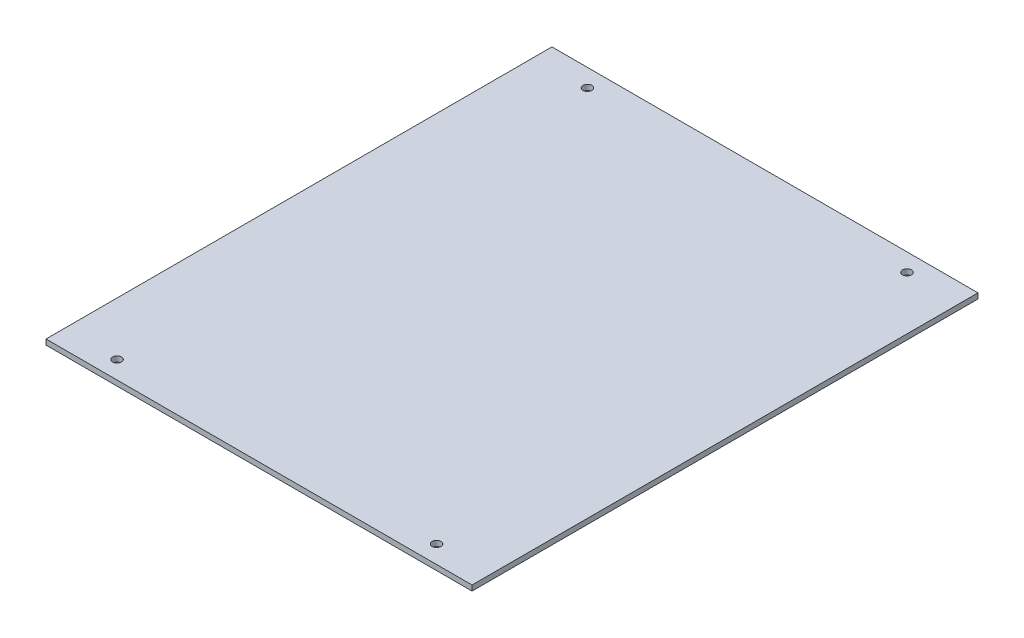
ISO-10303-21;
HEADER;
FILE_DESCRIPTION(('STEP AP214'),'2;1');
FILE_NAME('part.step','',(''),(''),'','','');
FILE_SCHEMA(('AUTOMOTIVE_DESIGN { 1 0 10303 214 1 1 1 1 }'));
ENDSEC;
DATA;
#1=APPLICATION_CONTEXT('core data for automotive mechanical design processes');
#2=APPLICATION_PROTOCOL_DEFINITION('international standard','automotive_design',2000,#1);
#3=PRODUCT_CONTEXT('',#1,'mechanical');
#4=PRODUCT('Part','Part','',(#3));
#5=PRODUCT_RELATED_PRODUCT_CATEGORY('part','',(#4));
#6=PRODUCT_DEFINITION_FORMATION('','',#4);
#7=PRODUCT_DEFINITION_CONTEXT('part definition',#1,'design');
#8=PRODUCT_DEFINITION('design','',#6,#7);
#9=PRODUCT_DEFINITION_SHAPE('','',#8);
#10=(LENGTH_UNIT() NAMED_UNIT(*) SI_UNIT(.MILLI.,.METRE.));
#11=(NAMED_UNIT(*) PLANE_ANGLE_UNIT() SI_UNIT($,.RADIAN.));
#12=(NAMED_UNIT(*) SI_UNIT($,.STERADIAN.) SOLID_ANGLE_UNIT());
#13=UNCERTAINTY_MEASURE_WITH_UNIT(LENGTH_MEASURE(1.E-05),#10,'distance_accuracy_value','');
#14=(GEOMETRIC_REPRESENTATION_CONTEXT(3) GLOBAL_UNCERTAINTY_ASSIGNED_CONTEXT((#13)) GLOBAL_UNIT_ASSIGNED_CONTEXT((#10,
#11,#12)) REPRESENTATION_CONTEXT('',''));
#15=CARTESIAN_POINT('',(0.,0.,0.));
#16=DIRECTION('',(0.,0.,1.));
#17=DIRECTION('',(1.,0.,0.));
#18=AXIS2_PLACEMENT_3D('',#15,#16,#17);
#19=CARTESIAN_POINT('',(120.,3.,-142.5));
#20=DIRECTION('',(-1.,0.,0.));
#21=DIRECTION('',(0.,0.,1.));
#22=AXIS2_PLACEMENT_3D('',#19,#20,#21);
#23=PLANE('',#22);
#24=DIRECTION('',(0.,0.,-1.));
#25=VECTOR('',#24,1.);
#26=CARTESIAN_POINT('',(120.,0.,-142.5));
#27=LINE('',#26,#25);
#28=CARTESIAN_POINT('',(120.,0.,142.5));
#29=VERTEX_POINT('',#28);
#30=CARTESIAN_POINT('',(120.,0.,-142.5));
#31=VERTEX_POINT('',#30);
#32=EDGE_CURVE('E96',#29,#31,#27,.T.);
#33=ORIENTED_EDGE('',*,*,#32,.T.);
#34=DIRECTION('',(0.,-1.,0.));
#35=VECTOR('',#34,1.);
#36=CARTESIAN_POINT('',(120.,3.,-142.5));
#37=LINE('',#36,#35);
#38=CARTESIAN_POINT('',(120.,3.,-142.5));
#39=VERTEX_POINT('',#38);
#40=EDGE_CURVE('E11',#39,#31,#37,.T.);
#41=ORIENTED_EDGE('',*,*,#40,.F.);
#42=DIRECTION('',(0.,0.,-1.));
#43=VECTOR('',#42,1.);
#44=CARTESIAN_POINT('',(120.,3.,-142.5));
#45=LINE('',#44,#43);
#46=CARTESIAN_POINT('',(120.,3.,142.5));
#47=VERTEX_POINT('',#46);
#48=EDGE_CURVE('E84',#47,#39,#45,.T.);
#49=ORIENTED_EDGE('',*,*,#48,.F.);
#50=DIRECTION('',(0.,-1.,0.));
#51=VECTOR('',#50,1.);
#52=CARTESIAN_POINT('',(120.,3.,142.5));
#53=LINE('',#52,#51);
#54=EDGE_CURVE('E92',#47,#29,#53,.T.);
#55=ORIENTED_EDGE('',*,*,#54,.T.);
#56=EDGE_LOOP('',(#33,#41,#49,#55));
#57=FACE_BOUND('',#56,.T.);
#58=ADVANCED_FACE('F33',(#57),#23,.F.);
#59=CARTESIAN_POINT('',(-120.,3.,-142.5));
#60=DIRECTION('',(0.,0.,1.));
#61=DIRECTION('',(1.,0.,0.));
#62=AXIS2_PLACEMENT_3D('',#59,#60,#61);
#63=PLANE('',#62);
#64=DIRECTION('',(-1.,0.,0.));
#65=VECTOR('',#64,1.);
#66=CARTESIAN_POINT('',(-120.,0.,-142.5));
#67=LINE('',#66,#65);
#68=CARTESIAN_POINT('',(-120.,0.,-142.5));
#69=VERTEX_POINT('',#68);
#70=EDGE_CURVE('E88',#31,#69,#67,.T.);
#71=ORIENTED_EDGE('',*,*,#70,.T.);
#72=DIRECTION('',(0.,-1.,0.));
#73=VECTOR('',#72,1.);
#74=CARTESIAN_POINT('',(-120.,3.,-142.5));
#75=LINE('',#74,#73);
#76=CARTESIAN_POINT('',(-120.,3.,-142.5));
#77=VERTEX_POINT('',#76);
#78=EDGE_CURVE('E41',#77,#69,#75,.T.);
#79=ORIENTED_EDGE('',*,*,#78,.F.);
#80=DIRECTION('',(-1.,0.,0.));
#81=VECTOR('',#80,1.);
#82=CARTESIAN_POINT('',(-120.,3.,-142.5));
#83=LINE('',#82,#81);
#84=EDGE_CURVE('E79',#39,#77,#83,.T.);
#85=ORIENTED_EDGE('',*,*,#84,.F.);
#86=ORIENTED_EDGE('',*,*,#40,.T.);
#87=EDGE_LOOP('',(#71,#79,#85,#86));
#88=FACE_BOUND('',#87,.T.);
#89=ADVANCED_FACE('F87',(#88),#63,.F.);
#90=CARTESIAN_POINT('',(-120.,3.,-142.5));
#91=DIRECTION('',(1.,0.,0.));
#92=DIRECTION('',(0.,0.,-1.));
#93=AXIS2_PLACEMENT_3D('',#90,#91,#92);
#94=PLANE('',#93);
#95=DIRECTION('',(0.,0.,1.));
#96=VECTOR('',#95,1.);
#97=CARTESIAN_POINT('',(-120.,0.,-142.5));
#98=LINE('',#97,#96);
#99=CARTESIAN_POINT('',(-120.,0.,142.5));
#100=VERTEX_POINT('',#99);
#101=EDGE_CURVE('E66',#69,#100,#98,.T.);
#102=ORIENTED_EDGE('',*,*,#101,.T.);
#103=DIRECTION('',(0.,-1.,0.));
#104=VECTOR('',#103,1.);
#105=CARTESIAN_POINT('',(-120.,3.,142.5));
#106=LINE('',#105,#104);
#107=CARTESIAN_POINT('',(-120.,3.,142.5));
#108=VERTEX_POINT('',#107);
#109=EDGE_CURVE('E89',#108,#100,#106,.T.);
#110=ORIENTED_EDGE('',*,*,#109,.F.);
#111=DIRECTION('',(0.,0.,1.));
#112=VECTOR('',#111,1.);
#113=CARTESIAN_POINT('',(-120.,3.,-142.5));
#114=LINE('',#113,#112);
#115=EDGE_CURVE('E82',#77,#108,#114,.T.);
#116=ORIENTED_EDGE('',*,*,#115,.F.);
#117=ORIENTED_EDGE('',*,*,#78,.T.);
#118=EDGE_LOOP('',(#102,#110,#116,#117));
#119=FACE_BOUND('',#118,.T.);
#120=ADVANCED_FACE('F90',(#119),#94,.F.);
#121=CARTESIAN_POINT('',(-120.,3.,142.5));
#122=DIRECTION('',(0.,0.,-1.));
#123=DIRECTION('',(-1.,0.,0.));
#124=AXIS2_PLACEMENT_3D('',#121,#122,#123);
#125=PLANE('',#124);
#126=DIRECTION('',(1.,0.,0.));
#127=VECTOR('',#126,1.);
#128=CARTESIAN_POINT('',(-120.,0.,142.5));
#129=LINE('',#128,#127);
#130=EDGE_CURVE('E72',#100,#29,#129,.T.);
#131=ORIENTED_EDGE('',*,*,#130,.T.);
#132=ORIENTED_EDGE('',*,*,#54,.F.);
#133=DIRECTION('',(1.,0.,0.));
#134=VECTOR('',#133,1.);
#135=CARTESIAN_POINT('',(-120.,3.,142.5));
#136=LINE('',#135,#134);
#137=EDGE_CURVE('E49',#108,#47,#136,.T.);
#138=ORIENTED_EDGE('',*,*,#137,.F.);
#139=ORIENTED_EDGE('',*,*,#109,.T.);
#140=EDGE_LOOP('',(#131,#132,#138,#139));
#141=FACE_BOUND('',#140,.T.);
#142=ADVANCED_FACE('F104',(#141),#125,.F.);
#143=CARTESIAN_POINT('',(0.,3.,0.));
#144=DIRECTION('',(0.,1.,0.));
#145=DIRECTION('',(0.,0.,1.));
#146=AXIS2_PLACEMENT_3D('',#143,#144,#145);
#147=PLANE('',#146);
#148=CARTESIAN_POINT('',(-89.9999999999998,3.,-132.5));
#149=DIRECTION('',(0.,1.,0.));
#150=DIRECTION('',(0.,0.,1.));
#151=AXIS2_PLACEMENT_3D('',#148,#149,#150);
#152=CIRCLE('',#151,2.50000000000001);
#153=CARTESIAN_POINT('',(-89.9999999999998,3.,-135.));
#154=VERTEX_POINT('',#153);
#155=EDGE_CURVE('E123',#154,#154,#152,.F.);
#156=ORIENTED_EDGE('',*,*,#155,.T.);
#157=EDGE_LOOP('',(#156));
#158=FACE_BOUND('',#157,.T.);
#159=CARTESIAN_POINT('',(90.,3.,132.5));
#160=DIRECTION('',(0.,1.,0.));
#161=DIRECTION('',(0.,0.,1.));
#162=AXIS2_PLACEMENT_3D('',#159,#160,#161);
#163=CIRCLE('',#162,2.5);
#164=CARTESIAN_POINT('',(90.,3.,130.));
#165=VERTEX_POINT('',#164);
#166=EDGE_CURVE('E116',#165,#165,#163,.F.);
#167=ORIENTED_EDGE('',*,*,#166,.T.);
#168=EDGE_LOOP('',(#167));
#169=FACE_BOUND('',#168,.T.);
#170=CARTESIAN_POINT('',(90.,3.,-132.5));
#171=DIRECTION('',(0.,1.,0.));
#172=DIRECTION('',(0.,0.,1.));
#173=AXIS2_PLACEMENT_3D('',#170,#171,#172);
#174=CIRCLE('',#173,2.5);
#175=CARTESIAN_POINT('',(90.,3.,-135.));
#176=VERTEX_POINT('',#175);
#177=EDGE_CURVE('E128',#176,#176,#174,.F.);
#178=ORIENTED_EDGE('',*,*,#177,.T.);
#179=EDGE_LOOP('',(#178));
#180=FACE_BOUND('',#179,.T.);
#181=CARTESIAN_POINT('',(-89.9999999999998,3.,132.5));
#182=DIRECTION('',(0.,1.,0.));
#183=DIRECTION('',(0.,0.,1.));
#184=AXIS2_PLACEMENT_3D('',#181,#182,#183);
#185=CIRCLE('',#184,2.50000000000001);
#186=CARTESIAN_POINT('',(-89.9999999999998,3.,130.));
#187=VERTEX_POINT('',#186);
#188=EDGE_CURVE('E110',#187,#187,#185,.F.);
#189=ORIENTED_EDGE('',*,*,#188,.T.);
#190=EDGE_LOOP('',(#189));
#191=FACE_BOUND('',#190,.T.);
#192=ORIENTED_EDGE('',*,*,#48,.T.);
#193=ORIENTED_EDGE('',*,*,#84,.T.);
#194=ORIENTED_EDGE('',*,*,#115,.T.);
#195=ORIENTED_EDGE('',*,*,#137,.T.);
#196=EDGE_LOOP('',(#192,#193,#194,#195));
#197=FACE_BOUND('',#196,.T.);
#198=ADVANCED_FACE('F80',(#158,#169,#180,#191,#197),#147,.T.);
#199=CARTESIAN_POINT('',(0.,0.,0.));
#200=DIRECTION('',(0.,1.,0.));
#201=DIRECTION('',(0.,0.,1.));
#202=AXIS2_PLACEMENT_3D('',#199,#200,#201);
#203=PLANE('',#202);
#204=CARTESIAN_POINT('',(-89.9999999999998,0.,-132.5));
#205=DIRECTION('',(0.,-1.,0.));
#206=DIRECTION('',(0.,0.,-1.));
#207=AXIS2_PLACEMENT_3D('',#204,#205,#206);
#208=CIRCLE('',#207,2.50000000000001);
#209=CARTESIAN_POINT('',(-89.9999999999998,0.,-135.));
#210=VERTEX_POINT('',#209);
#211=EDGE_CURVE('E113',#210,#210,#208,.T.);
#212=ORIENTED_EDGE('',*,*,#211,.F.);
#213=EDGE_LOOP('',(#212));
#214=FACE_BOUND('',#213,.T.);
#215=CARTESIAN_POINT('',(90.,0.,132.5));
#216=DIRECTION('',(0.,-1.,0.));
#217=DIRECTION('',(0.,0.,-1.));
#218=AXIS2_PLACEMENT_3D('',#215,#216,#217);
#219=CIRCLE('',#218,2.5);
#220=CARTESIAN_POINT('',(90.,0.,130.));
#221=VERTEX_POINT('',#220);
#222=EDGE_CURVE('E119',#221,#221,#219,.T.);
#223=ORIENTED_EDGE('',*,*,#222,.F.);
#224=EDGE_LOOP('',(#223));
#225=FACE_BOUND('',#224,.T.);
#226=CARTESIAN_POINT('',(90.,0.,-132.5));
#227=DIRECTION('',(0.,-1.,0.));
#228=DIRECTION('',(0.,0.,-1.));
#229=AXIS2_PLACEMENT_3D('',#226,#227,#228);
#230=CIRCLE('',#229,2.5);
#231=CARTESIAN_POINT('',(90.,0.,-135.));
#232=VERTEX_POINT('',#231);
#233=EDGE_CURVE('E120',#232,#232,#230,.T.);
#234=ORIENTED_EDGE('',*,*,#233,.F.);
#235=EDGE_LOOP('',(#234));
#236=FACE_BOUND('',#235,.T.);
#237=CARTESIAN_POINT('',(-89.9999999999998,0.,132.5));
#238=DIRECTION('',(0.,-1.,0.));
#239=DIRECTION('',(0.,0.,-1.));
#240=AXIS2_PLACEMENT_3D('',#237,#238,#239);
#241=CIRCLE('',#240,2.50000000000001);
#242=CARTESIAN_POINT('',(-89.9999999999998,0.,130.));
#243=VERTEX_POINT('',#242);
#244=EDGE_CURVE('E99',#243,#243,#241,.T.);
#245=ORIENTED_EDGE('',*,*,#244,.F.);
#246=EDGE_LOOP('',(#245));
#247=FACE_BOUND('',#246,.T.);
#248=ORIENTED_EDGE('',*,*,#32,.F.);
#249=ORIENTED_EDGE('',*,*,#130,.F.);
#250=ORIENTED_EDGE('',*,*,#101,.F.);
#251=ORIENTED_EDGE('',*,*,#70,.F.);
#252=EDGE_LOOP('',(#248,#249,#250,#251));
#253=FACE_BOUND('',#252,.T.);
#254=ADVANCED_FACE('F107',(#214,#225,#236,#247,#253),#203,.F.);
#255=CARTESIAN_POINT('',(-89.9999999999998,3.001,132.5));
#256=DIRECTION('',(0.,-1.,0.));
#257=DIRECTION('',(0.,0.,-1.));
#258=AXIS2_PLACEMENT_3D('',#255,#256,#257);
#259=CYLINDRICAL_SURFACE('',#258,2.50000000000001);
#260=CARTESIAN_POINT('',(-89.9999999999998,3.,130.));
#261=CARTESIAN_POINT('',(-89.9999999999998,2.96875,130.));
#262=CARTESIAN_POINT('',(-89.9999999999998,2.9375,130.));
#263=CARTESIAN_POINT('',(-89.9999999999998,2.875,130.));
#264=CARTESIAN_POINT('',(-89.9999999999998,2.84375,130.));
#265=CARTESIAN_POINT('',(-89.9999999999998,2.78125,130.));
#266=CARTESIAN_POINT('',(-89.9999999999998,2.75,130.));
#267=CARTESIAN_POINT('',(-89.9999999999998,2.6875,130.));
#268=CARTESIAN_POINT('',(-89.9999999999998,2.65625,130.));
#269=CARTESIAN_POINT('',(-89.9999999999998,2.59375,130.));
#270=CARTESIAN_POINT('',(-89.9999999999998,2.5625,130.));
#271=CARTESIAN_POINT('',(-89.9999999999998,2.5,130.));
#272=CARTESIAN_POINT('',(-89.9999999999998,2.46875,130.));
#273=CARTESIAN_POINT('',(-89.9999999999998,2.40625,130.));
#274=CARTESIAN_POINT('',(-89.9999999999998,2.375,130.));
#275=CARTESIAN_POINT('',(-89.9999999999998,2.3125,130.));
#276=CARTESIAN_POINT('',(-89.9999999999998,2.28125,130.));
#277=CARTESIAN_POINT('',(-89.9999999999998,2.21875,130.));
#278=CARTESIAN_POINT('',(-89.9999999999998,2.1875,130.));
#279=CARTESIAN_POINT('',(-89.9999999999998,2.125,130.));
#280=CARTESIAN_POINT('',(-89.9999999999998,2.09375,130.));
#281=CARTESIAN_POINT('',(-89.9999999999998,2.03125,130.));
#282=CARTESIAN_POINT('',(-89.9999999999998,2.,130.));
#283=CARTESIAN_POINT('',(-89.9999999999998,1.9375,130.));
#284=CARTESIAN_POINT('',(-89.9999999999998,1.90625,130.));
#285=CARTESIAN_POINT('',(-89.9999999999998,1.84375,130.));
#286=CARTESIAN_POINT('',(-89.9999999999998,1.8125,130.));
#287=CARTESIAN_POINT('',(-89.9999999999998,1.75,130.));
#288=CARTESIAN_POINT('',(-89.9999999999998,1.71875,130.));
#289=CARTESIAN_POINT('',(-89.9999999999998,1.65625,130.));
#290=CARTESIAN_POINT('',(-89.9999999999998,1.625,130.));
#291=CARTESIAN_POINT('',(-89.9999999999998,1.5625,130.));
#292=CARTESIAN_POINT('',(-89.9999999999998,1.53125,130.));
#293=CARTESIAN_POINT('',(-89.9999999999998,1.46875,130.));
#294=CARTESIAN_POINT('',(-89.9999999999998,1.4375,130.));
#295=CARTESIAN_POINT('',(-89.9999999999998,1.375,130.));
#296=CARTESIAN_POINT('',(-89.9999999999998,1.34375,130.));
#297=CARTESIAN_POINT('',(-89.9999999999998,1.28125,130.));
#298=CARTESIAN_POINT('',(-89.9999999999998,1.25,130.));
#299=CARTESIAN_POINT('',(-89.9999999999998,1.1875,130.));
#300=CARTESIAN_POINT('',(-89.9999999999998,1.15625,130.));
#301=CARTESIAN_POINT('',(-89.9999999999998,1.09375,130.));
#302=CARTESIAN_POINT('',(-89.9999999999998,1.0625,130.));
#303=CARTESIAN_POINT('',(-89.9999999999998,1.,130.));
#304=CARTESIAN_POINT('',(-89.9999999999998,0.96875,130.));
#305=CARTESIAN_POINT('',(-89.9999999999998,0.90625,130.));
#306=CARTESIAN_POINT('',(-89.9999999999998,0.875,130.));
#307=CARTESIAN_POINT('',(-89.9999999999998,0.8125,130.));
#308=CARTESIAN_POINT('',(-89.9999999999998,0.78125,130.));
#309=CARTESIAN_POINT('',(-89.9999999999998,0.71875,130.));
#310=CARTESIAN_POINT('',(-89.9999999999998,0.6875,130.));
#311=CARTESIAN_POINT('',(-89.9999999999998,0.625,130.));
#312=CARTESIAN_POINT('',(-89.9999999999998,0.59375,130.));
#313=CARTESIAN_POINT('',(-89.9999999999998,0.53125,130.));
#314=CARTESIAN_POINT('',(-89.9999999999998,0.5,130.));
#315=CARTESIAN_POINT('',(-89.9999999999998,0.4375,130.));
#316=CARTESIAN_POINT('',(-89.9999999999998,0.40625,130.));
#317=CARTESIAN_POINT('',(-89.9999999999998,0.34375,130.));
#318=CARTESIAN_POINT('',(-89.9999999999998,0.3125,130.));
#319=CARTESIAN_POINT('',(-89.9999999999998,0.25,130.));
#320=CARTESIAN_POINT('',(-89.9999999999998,0.21875,130.));
#321=CARTESIAN_POINT('',(-89.9999999999998,0.156250000000001,130.));
#322=CARTESIAN_POINT('',(-89.9999999999998,0.125000000000001,130.));
#323=CARTESIAN_POINT('',(-89.9999999999998,0.0625000000000005,130.));
#324=CARTESIAN_POINT('',(-89.9999999999998,0.0312500000000005,130.));
#325=CARTESIAN_POINT('',(-89.9999999999998,0.,130.));
#326=B_SPLINE_CURVE_WITH_KNOTS('',3,(#260,#261,#262,#263,#264,#265,#266,#267,#268,#269,#270,
#271,#272,#273,#274,#275,#276,#277,#278,#279,#280,#281,#282,#283,#284,#285,#286,#287,#288,#289,
#290,#291,#292,#293,#294,#295,#296,#297,#298,#299,#300,#301,#302,#303,#304,#305,#306,#307,#308,
#309,#310,#311,#312,#313,#314,#315,#316,#317,#318,#319,#320,#321,#322,#323,#324,#325),
.UNSPECIFIED.,.F.,.F.,(4,2,2,2,2,2,2,2,2,2,2,2,2,2,2,2,2,2,2,2,2,2,2,2,2,2,2,2,2,2,2,2,4),(0.,
0.0937499999999997,0.1875,0.28125,0.375,0.46875,0.5625,0.65625,0.749999999999999,
0.843749999999999,0.9375,1.03125,1.125,1.21875,1.3125,1.40625,1.5,1.59375,1.6875,1.78125,1.875,
1.96875,2.0625,2.15625,2.25,2.34375,2.4375,2.53125,2.625,2.71875,2.8125,2.90625,3.),.UNSPECIFIED.);
#327=EDGE_CURVE('BSEAM138',#187,#243,#326,.T.);
#328=ORIENTED_EDGE('',*,*,#188,.F.);
#329=ORIENTED_EDGE('',*,*,#244,.T.);
#330=ORIENTED_EDGE('',*,*,#327,.T.);
#331=ORIENTED_EDGE('',*,*,#327,.F.);
#332=EDGE_LOOP('',(#328,#330,#329,#331));
#333=FACE_BOUND('',#332,.T.);
#334=ADVANCED_FACE('F138',(#333),#259,.F.);
#335=CARTESIAN_POINT('',(90.,3.001,-132.5));
#336=DIRECTION('',(0.,-1.,0.));
#337=DIRECTION('',(0.,0.,-1.));
#338=AXIS2_PLACEMENT_3D('',#335,#336,#337);
#339=CYLINDRICAL_SURFACE('',#338,2.5);
#340=CARTESIAN_POINT('',(90.,3.,-135.));
#341=CARTESIAN_POINT('',(90.,2.96875,-135.));
#342=CARTESIAN_POINT('',(90.,2.9375,-135.));
#343=CARTESIAN_POINT('',(90.,2.875,-135.));
#344=CARTESIAN_POINT('',(90.,2.84375,-135.));
#345=CARTESIAN_POINT('',(90.,2.78125,-135.));
#346=CARTESIAN_POINT('',(90.,2.75,-135.));
#347=CARTESIAN_POINT('',(90.,2.6875,-135.));
#348=CARTESIAN_POINT('',(90.,2.65625,-135.));
#349=CARTESIAN_POINT('',(90.,2.59375,-135.));
#350=CARTESIAN_POINT('',(90.,2.5625,-135.));
#351=CARTESIAN_POINT('',(90.,2.5,-135.));
#352=CARTESIAN_POINT('',(90.,2.46875,-135.));
#353=CARTESIAN_POINT('',(90.,2.40625,-135.));
#354=CARTESIAN_POINT('',(90.,2.375,-135.));
#355=CARTESIAN_POINT('',(90.,2.3125,-135.));
#356=CARTESIAN_POINT('',(90.,2.28125,-135.));
#357=CARTESIAN_POINT('',(90.,2.21875,-135.));
#358=CARTESIAN_POINT('',(90.,2.1875,-135.));
#359=CARTESIAN_POINT('',(90.,2.125,-135.));
#360=CARTESIAN_POINT('',(90.,2.09375,-135.));
#361=CARTESIAN_POINT('',(90.,2.03125,-135.));
#362=CARTESIAN_POINT('',(90.,2.,-135.));
#363=CARTESIAN_POINT('',(90.,1.9375,-135.));
#364=CARTESIAN_POINT('',(90.,1.90625,-135.));
#365=CARTESIAN_POINT('',(90.,1.84375,-135.));
#366=CARTESIAN_POINT('',(90.,1.8125,-135.));
#367=CARTESIAN_POINT('',(90.,1.75,-135.));
#368=CARTESIAN_POINT('',(90.,1.71875,-135.));
#369=CARTESIAN_POINT('',(90.,1.65625,-135.));
#370=CARTESIAN_POINT('',(90.,1.625,-135.));
#371=CARTESIAN_POINT('',(90.,1.5625,-135.));
#372=CARTESIAN_POINT('',(90.,1.53125,-135.));
#373=CARTESIAN_POINT('',(90.,1.46875,-135.));
#374=CARTESIAN_POINT('',(90.,1.4375,-135.));
#375=CARTESIAN_POINT('',(90.,1.375,-135.));
#376=CARTESIAN_POINT('',(90.,1.34375,-135.));
#377=CARTESIAN_POINT('',(90.,1.28125,-135.));
#378=CARTESIAN_POINT('',(90.,1.25,-135.));
#379=CARTESIAN_POINT('',(90.,1.1875,-135.));
#380=CARTESIAN_POINT('',(90.,1.15625,-135.));
#381=CARTESIAN_POINT('',(90.,1.09375,-135.));
#382=CARTESIAN_POINT('',(90.,1.0625,-135.));
#383=CARTESIAN_POINT('',(90.,1.,-135.));
#384=CARTESIAN_POINT('',(90.,0.96875,-135.));
#385=CARTESIAN_POINT('',(90.,0.90625,-135.));
#386=CARTESIAN_POINT('',(90.,0.875,-135.));
#387=CARTESIAN_POINT('',(90.,0.8125,-135.));
#388=CARTESIAN_POINT('',(90.,0.78125,-135.));
#389=CARTESIAN_POINT('',(90.,0.71875,-135.));
#390=CARTESIAN_POINT('',(90.,0.6875,-135.));
#391=CARTESIAN_POINT('',(90.,0.625,-135.));
#392=CARTESIAN_POINT('',(90.,0.59375,-135.));
#393=CARTESIAN_POINT('',(90.,0.53125,-135.));
#394=CARTESIAN_POINT('',(90.,0.5,-135.));
#395=CARTESIAN_POINT('',(90.,0.4375,-135.));
#396=CARTESIAN_POINT('',(90.,0.40625,-135.));
#397=CARTESIAN_POINT('',(90.,0.34375,-135.));
#398=CARTESIAN_POINT('',(90.,0.3125,-135.));
#399=CARTESIAN_POINT('',(90.,0.25,-135.));
#400=CARTESIAN_POINT('',(90.,0.21875,-135.));
#401=CARTESIAN_POINT('',(90.,0.156250000000001,-135.));
#402=CARTESIAN_POINT('',(90.,0.125000000000001,-135.));
#403=CARTESIAN_POINT('',(90.,0.0625000000000005,-135.));
#404=CARTESIAN_POINT('',(90.,0.0312500000000005,-135.));
#405=CARTESIAN_POINT('',(90.,0.,-135.));
#406=B_SPLINE_CURVE_WITH_KNOTS('',3,(#340,#341,#342,#343,#344,#345,#346,#347,#348,#349,#350,
#351,#352,#353,#354,#355,#356,#357,#358,#359,#360,#361,#362,#363,#364,#365,#366,#367,#368,#369,
#370,#371,#372,#373,#374,#375,#376,#377,#378,#379,#380,#381,#382,#383,#384,#385,#386,#387,#388,
#389,#390,#391,#392,#393,#394,#395,#396,#397,#398,#399,#400,#401,#402,#403,#404,#405),
.UNSPECIFIED.,.F.,.F.,(4,2,2,2,2,2,2,2,2,2,2,2,2,2,2,2,2,2,2,2,2,2,2,2,2,2,2,2,2,2,2,2,4),(0.,
0.0937499999999997,0.1875,0.28125,0.375,0.46875,0.5625,0.65625,0.749999999999999,
0.843749999999999,0.9375,1.03125,1.125,1.21875,1.3125,1.40625,1.5,1.59375,1.6875,1.78125,1.875,
1.96875,2.0625,2.15625,2.25,2.34375,2.4375,2.53125,2.625,2.71875,2.8125,2.90625,3.),.UNSPECIFIED.);
#407=EDGE_CURVE('BSEAM134',#176,#232,#406,.T.);
#408=ORIENTED_EDGE('',*,*,#177,.F.);
#409=ORIENTED_EDGE('',*,*,#233,.T.);
#410=ORIENTED_EDGE('',*,*,#407,.T.);
#411=ORIENTED_EDGE('',*,*,#407,.F.);
#412=EDGE_LOOP('',(#408,#410,#409,#411));
#413=FACE_BOUND('',#412,.T.);
#414=ADVANCED_FACE('F134',(#413),#339,.F.);
#415=CARTESIAN_POINT('',(90.,3.001,132.5));
#416=DIRECTION('',(0.,-1.,0.));
#417=DIRECTION('',(0.,0.,-1.));
#418=AXIS2_PLACEMENT_3D('',#415,#416,#417);
#419=CYLINDRICAL_SURFACE('',#418,2.5);
#420=CARTESIAN_POINT('',(90.,3.,130.));
#421=CARTESIAN_POINT('',(90.,2.96875,130.));
#422=CARTESIAN_POINT('',(90.,2.9375,130.));
#423=CARTESIAN_POINT('',(90.,2.875,130.));
#424=CARTESIAN_POINT('',(90.,2.84375,130.));
#425=CARTESIAN_POINT('',(90.,2.78125,130.));
#426=CARTESIAN_POINT('',(90.,2.75,130.));
#427=CARTESIAN_POINT('',(90.,2.6875,130.));
#428=CARTESIAN_POINT('',(90.,2.65625,130.));
#429=CARTESIAN_POINT('',(90.,2.59375,130.));
#430=CARTESIAN_POINT('',(90.,2.5625,130.));
#431=CARTESIAN_POINT('',(90.,2.5,130.));
#432=CARTESIAN_POINT('',(90.,2.46875,130.));
#433=CARTESIAN_POINT('',(90.,2.40625,130.));
#434=CARTESIAN_POINT('',(90.,2.375,130.));
#435=CARTESIAN_POINT('',(90.,2.3125,130.));
#436=CARTESIAN_POINT('',(90.,2.28125,130.));
#437=CARTESIAN_POINT('',(90.,2.21875,130.));
#438=CARTESIAN_POINT('',(90.,2.1875,130.));
#439=CARTESIAN_POINT('',(90.,2.125,130.));
#440=CARTESIAN_POINT('',(90.,2.09375,130.));
#441=CARTESIAN_POINT('',(90.,2.03125,130.));
#442=CARTESIAN_POINT('',(90.,2.,130.));
#443=CARTESIAN_POINT('',(90.,1.9375,130.));
#444=CARTESIAN_POINT('',(90.,1.90625,130.));
#445=CARTESIAN_POINT('',(90.,1.84375,130.));
#446=CARTESIAN_POINT('',(90.,1.8125,130.));
#447=CARTESIAN_POINT('',(90.,1.75,130.));
#448=CARTESIAN_POINT('',(90.,1.71875,130.));
#449=CARTESIAN_POINT('',(90.,1.65625,130.));
#450=CARTESIAN_POINT('',(90.,1.625,130.));
#451=CARTESIAN_POINT('',(90.,1.5625,130.));
#452=CARTESIAN_POINT('',(90.,1.53125,130.));
#453=CARTESIAN_POINT('',(90.,1.46875,130.));
#454=CARTESIAN_POINT('',(90.,1.4375,130.));
#455=CARTESIAN_POINT('',(90.,1.375,130.));
#456=CARTESIAN_POINT('',(90.,1.34375,130.));
#457=CARTESIAN_POINT('',(90.,1.28125,130.));
#458=CARTESIAN_POINT('',(90.,1.25,130.));
#459=CARTESIAN_POINT('',(90.,1.1875,130.));
#460=CARTESIAN_POINT('',(90.,1.15625,130.));
#461=CARTESIAN_POINT('',(90.,1.09375,130.));
#462=CARTESIAN_POINT('',(90.,1.0625,130.));
#463=CARTESIAN_POINT('',(90.,1.,130.));
#464=CARTESIAN_POINT('',(90.,0.96875,130.));
#465=CARTESIAN_POINT('',(90.,0.90625,130.));
#466=CARTESIAN_POINT('',(90.,0.875,130.));
#467=CARTESIAN_POINT('',(90.,0.8125,130.));
#468=CARTESIAN_POINT('',(90.,0.78125,130.));
#469=CARTESIAN_POINT('',(90.,0.71875,130.));
#470=CARTESIAN_POINT('',(90.,0.6875,130.));
#471=CARTESIAN_POINT('',(90.,0.625,130.));
#472=CARTESIAN_POINT('',(90.,0.59375,130.));
#473=CARTESIAN_POINT('',(90.,0.53125,130.));
#474=CARTESIAN_POINT('',(90.,0.5,130.));
#475=CARTESIAN_POINT('',(90.,0.4375,130.));
#476=CARTESIAN_POINT('',(90.,0.40625,130.));
#477=CARTESIAN_POINT('',(90.,0.34375,130.));
#478=CARTESIAN_POINT('',(90.,0.3125,130.));
#479=CARTESIAN_POINT('',(90.,0.25,130.));
#480=CARTESIAN_POINT('',(90.,0.21875,130.));
#481=CARTESIAN_POINT('',(90.,0.156250000000001,130.));
#482=CARTESIAN_POINT('',(90.,0.125000000000001,130.));
#483=CARTESIAN_POINT('',(90.,0.0625000000000005,130.));
#484=CARTESIAN_POINT('',(90.,0.0312500000000005,130.));
#485=CARTESIAN_POINT('',(90.,0.,130.));
#486=B_SPLINE_CURVE_WITH_KNOTS('',3,(#420,#421,#422,#423,#424,#425,#426,#427,#428,#429,#430,
#431,#432,#433,#434,#435,#436,#437,#438,#439,#440,#441,#442,#443,#444,#445,#446,#447,#448,#449,
#450,#451,#452,#453,#454,#455,#456,#457,#458,#459,#460,#461,#462,#463,#464,#465,#466,#467,#468,
#469,#470,#471,#472,#473,#474,#475,#476,#477,#478,#479,#480,#481,#482,#483,#484,#485),
.UNSPECIFIED.,.F.,.F.,(4,2,2,2,2,2,2,2,2,2,2,2,2,2,2,2,2,2,2,2,2,2,2,2,2,2,2,2,2,2,2,2,4),(0.,
0.0937499999999997,0.1875,0.28125,0.375,0.46875,0.5625,0.65625,0.749999999999999,
0.843749999999999,0.9375,1.03125,1.125,1.21875,1.3125,1.40625,1.5,1.59375,1.6875,1.78125,1.875,
1.96875,2.0625,2.15625,2.25,2.34375,2.4375,2.53125,2.625,2.71875,2.8125,2.90625,3.),.UNSPECIFIED.);
#487=EDGE_CURVE('BSEAM150',#165,#221,#486,.T.);
#488=ORIENTED_EDGE('',*,*,#166,.F.);
#489=ORIENTED_EDGE('',*,*,#222,.T.);
#490=ORIENTED_EDGE('',*,*,#487,.T.);
#491=ORIENTED_EDGE('',*,*,#487,.F.);
#492=EDGE_LOOP('',(#488,#490,#489,#491));
#493=FACE_BOUND('',#492,.T.);
#494=ADVANCED_FACE('F150',(#493),#419,.F.);
#495=CARTESIAN_POINT('',(-89.9999999999998,3.001,-132.5));
#496=DIRECTION('',(0.,-1.,0.));
#497=DIRECTION('',(0.,0.,-1.));
#498=AXIS2_PLACEMENT_3D('',#495,#496,#497);
#499=CYLINDRICAL_SURFACE('',#498,2.50000000000001);
#500=CARTESIAN_POINT('',(-89.9999999999998,3.,-135.));
#501=CARTESIAN_POINT('',(-89.9999999999998,2.96875,-135.));
#502=CARTESIAN_POINT('',(-89.9999999999998,2.9375,-135.));
#503=CARTESIAN_POINT('',(-89.9999999999998,2.875,-135.));
#504=CARTESIAN_POINT('',(-89.9999999999998,2.84375,-135.));
#505=CARTESIAN_POINT('',(-89.9999999999998,2.78125,-135.));
#506=CARTESIAN_POINT('',(-89.9999999999998,2.75,-135.));
#507=CARTESIAN_POINT('',(-89.9999999999998,2.6875,-135.));
#508=CARTESIAN_POINT('',(-89.9999999999998,2.65625,-135.));
#509=CARTESIAN_POINT('',(-89.9999999999998,2.59375,-135.));
#510=CARTESIAN_POINT('',(-89.9999999999998,2.5625,-135.));
#511=CARTESIAN_POINT('',(-89.9999999999998,2.5,-135.));
#512=CARTESIAN_POINT('',(-89.9999999999998,2.46875,-135.));
#513=CARTESIAN_POINT('',(-89.9999999999998,2.40625,-135.));
#514=CARTESIAN_POINT('',(-89.9999999999998,2.375,-135.));
#515=CARTESIAN_POINT('',(-89.9999999999998,2.3125,-135.));
#516=CARTESIAN_POINT('',(-89.9999999999998,2.28125,-135.));
#517=CARTESIAN_POINT('',(-89.9999999999998,2.21875,-135.));
#518=CARTESIAN_POINT('',(-89.9999999999998,2.1875,-135.));
#519=CARTESIAN_POINT('',(-89.9999999999998,2.125,-135.));
#520=CARTESIAN_POINT('',(-89.9999999999998,2.09375,-135.));
#521=CARTESIAN_POINT('',(-89.9999999999998,2.03125,-135.));
#522=CARTESIAN_POINT('',(-89.9999999999998,2.,-135.));
#523=CARTESIAN_POINT('',(-89.9999999999998,1.9375,-135.));
#524=CARTESIAN_POINT('',(-89.9999999999998,1.90625,-135.));
#525=CARTESIAN_POINT('',(-89.9999999999998,1.84375,-135.));
#526=CARTESIAN_POINT('',(-89.9999999999998,1.8125,-135.));
#527=CARTESIAN_POINT('',(-89.9999999999998,1.75,-135.));
#528=CARTESIAN_POINT('',(-89.9999999999998,1.71875,-135.));
#529=CARTESIAN_POINT('',(-89.9999999999998,1.65625,-135.));
#530=CARTESIAN_POINT('',(-89.9999999999998,1.625,-135.));
#531=CARTESIAN_POINT('',(-89.9999999999998,1.5625,-135.));
#532=CARTESIAN_POINT('',(-89.9999999999998,1.53125,-135.));
#533=CARTESIAN_POINT('',(-89.9999999999998,1.46875,-135.));
#534=CARTESIAN_POINT('',(-89.9999999999998,1.4375,-135.));
#535=CARTESIAN_POINT('',(-89.9999999999998,1.375,-135.));
#536=CARTESIAN_POINT('',(-89.9999999999998,1.34375,-135.));
#537=CARTESIAN_POINT('',(-89.9999999999998,1.28125,-135.));
#538=CARTESIAN_POINT('',(-89.9999999999998,1.25,-135.));
#539=CARTESIAN_POINT('',(-89.9999999999998,1.1875,-135.));
#540=CARTESIAN_POINT('',(-89.9999999999998,1.15625,-135.));
#541=CARTESIAN_POINT('',(-89.9999999999998,1.09375,-135.));
#542=CARTESIAN_POINT('',(-89.9999999999998,1.0625,-135.));
#543=CARTESIAN_POINT('',(-89.9999999999998,1.,-135.));
#544=CARTESIAN_POINT('',(-89.9999999999998,0.96875,-135.));
#545=CARTESIAN_POINT('',(-89.9999999999998,0.90625,-135.));
#546=CARTESIAN_POINT('',(-89.9999999999998,0.875,-135.));
#547=CARTESIAN_POINT('',(-89.9999999999998,0.8125,-135.));
#548=CARTESIAN_POINT('',(-89.9999999999998,0.78125,-135.));
#549=CARTESIAN_POINT('',(-89.9999999999998,0.71875,-135.));
#550=CARTESIAN_POINT('',(-89.9999999999998,0.6875,-135.));
#551=CARTESIAN_POINT('',(-89.9999999999998,0.625,-135.));
#552=CARTESIAN_POINT('',(-89.9999999999998,0.59375,-135.));
#553=CARTESIAN_POINT('',(-89.9999999999998,0.53125,-135.));
#554=CARTESIAN_POINT('',(-89.9999999999998,0.5,-135.));
#555=CARTESIAN_POINT('',(-89.9999999999998,0.4375,-135.));
#556=CARTESIAN_POINT('',(-89.9999999999998,0.40625,-135.));
#557=CARTESIAN_POINT('',(-89.9999999999998,0.34375,-135.));
#558=CARTESIAN_POINT('',(-89.9999999999998,0.3125,-135.));
#559=CARTESIAN_POINT('',(-89.9999999999998,0.25,-135.));
#560=CARTESIAN_POINT('',(-89.9999999999998,0.21875,-135.));
#561=CARTESIAN_POINT('',(-89.9999999999998,0.156250000000001,-135.));
#562=CARTESIAN_POINT('',(-89.9999999999998,0.125000000000001,-135.));
#563=CARTESIAN_POINT('',(-89.9999999999998,0.0625000000000005,-135.));
#564=CARTESIAN_POINT('',(-89.9999999999998,0.0312500000000005,-135.));
#565=CARTESIAN_POINT('',(-89.9999999999998,0.,-135.));
#566=B_SPLINE_CURVE_WITH_KNOTS('',3,(#500,#501,#502,#503,#504,#505,#506,#507,#508,#509,#510,
#511,#512,#513,#514,#515,#516,#517,#518,#519,#520,#521,#522,#523,#524,#525,#526,#527,#528,#529,
#530,#531,#532,#533,#534,#535,#536,#537,#538,#539,#540,#541,#542,#543,#544,#545,#546,#547,#548,
#549,#550,#551,#552,#553,#554,#555,#556,#557,#558,#559,#560,#561,#562,#563,#564,#565),
.UNSPECIFIED.,.F.,.F.,(4,2,2,2,2,2,2,2,2,2,2,2,2,2,2,2,2,2,2,2,2,2,2,2,2,2,2,2,2,2,2,2,4),(0.,
0.0937499999999997,0.1875,0.28125,0.375,0.46875,0.5625,0.65625,0.749999999999999,
0.843749999999999,0.9375,1.03125,1.125,1.21875,1.3125,1.40625,1.5,1.59375,1.6875,1.78125,1.875,
1.96875,2.0625,2.15625,2.25,2.34375,2.4375,2.53125,2.625,2.71875,2.8125,2.90625,3.),.UNSPECIFIED.);
#567=EDGE_CURVE('BSEAM180',#154,#210,#566,.T.);
#568=ORIENTED_EDGE('',*,*,#155,.F.);
#569=ORIENTED_EDGE('',*,*,#211,.T.);
#570=ORIENTED_EDGE('',*,*,#567,.T.);
#571=ORIENTED_EDGE('',*,*,#567,.F.);
#572=EDGE_LOOP('',(#568,#570,#569,#571));
#573=FACE_BOUND('',#572,.T.);
#574=ADVANCED_FACE('F180',(#573),#499,.F.);
#575=CLOSED_SHELL('',(#58,#89,#120,#142,#198,#254,#334,#414,#494,#574));
#576=MANIFOLD_SOLID_BREP('B2',#575);
#577=ADVANCED_BREP_SHAPE_REPRESENTATION('',(#18,#576),#14);
#578=SHAPE_DEFINITION_REPRESENTATION(#9,#577);
ENDSEC;
END-ISO-10303-21;
